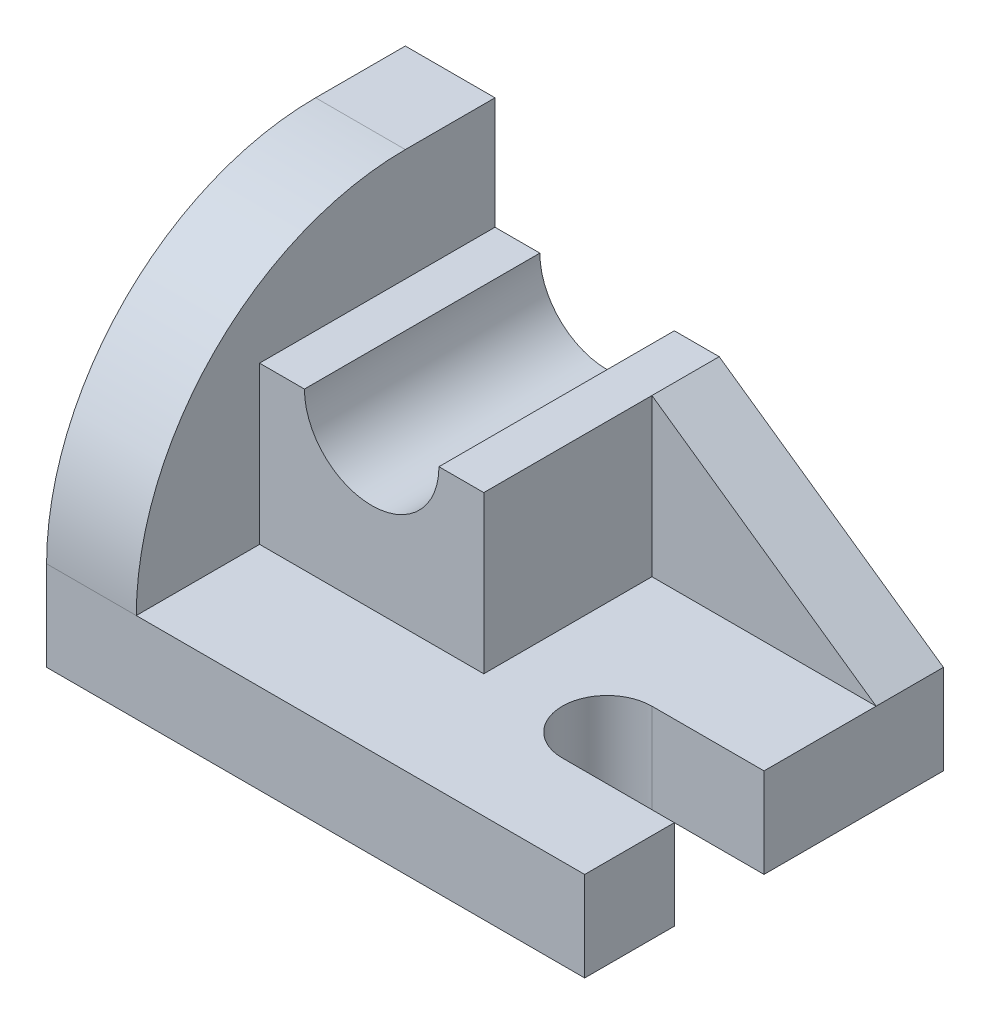
ISO-10303-21;
HEADER;
FILE_DESCRIPTION(('STEP AP214'),'2;1');
FILE_NAME('part.step','',(''),(''),'','','');
FILE_SCHEMA(('AUTOMOTIVE_DESIGN { 1 0 10303 214 1 1 1 1 }'));
ENDSEC;
DATA;
#1=APPLICATION_CONTEXT('core data for automotive mechanical design processes');
#2=APPLICATION_PROTOCOL_DEFINITION('international standard','automotive_design',2000,#1);
#3=PRODUCT_CONTEXT('',#1,'mechanical');
#4=PRODUCT('Part','Part','',(#3));
#5=PRODUCT_RELATED_PRODUCT_CATEGORY('part','',(#4));
#6=PRODUCT_DEFINITION_FORMATION('','',#4);
#7=PRODUCT_DEFINITION_CONTEXT('part definition',#1,'design');
#8=PRODUCT_DEFINITION('design','',#6,#7);
#9=PRODUCT_DEFINITION_SHAPE('','',#8);
#10=(LENGTH_UNIT() NAMED_UNIT(*) SI_UNIT(.MILLI.,.METRE.));
#11=(NAMED_UNIT(*) PLANE_ANGLE_UNIT() SI_UNIT($,.RADIAN.));
#12=(NAMED_UNIT(*) SI_UNIT($,.STERADIAN.) SOLID_ANGLE_UNIT());
#13=UNCERTAINTY_MEASURE_WITH_UNIT(LENGTH_MEASURE(1.E-05),#10,'distance_accuracy_value','');
#14=(GEOMETRIC_REPRESENTATION_CONTEXT(3) GLOBAL_UNCERTAINTY_ASSIGNED_CONTEXT((#13)) GLOBAL_UNIT_ASSIGNED_CONTEXT((#10,
#11,#12)) REPRESENTATION_CONTEXT('',''));
#15=CARTESIAN_POINT('',(0.,0.,0.));
#16=DIRECTION('',(0.,0.,1.));
#17=DIRECTION('',(1.,0.,0.));
#18=AXIS2_PLACEMENT_3D('',#15,#16,#17);
#19=CARTESIAN_POINT('',(0.,44.,0.));
#20=DIRECTION('',(0.,1.,0.));
#21=DIRECTION('',(0.,0.,1.));
#22=AXIS2_PLACEMENT_3D('',#19,#20,#21);
#23=PLANE('',#22);
#24=DIRECTION('',(0.,0.,1.));
#25=VECTOR('',#24,1.);
#26=CARTESIAN_POINT('',(24.,44.,-64.001));
#27=LINE('',#26,#25);
#28=CARTESIAN_POINT('',(24.,44.,-22.));
#29=VERTEX_POINT('',#28);
#30=CARTESIAN_POINT('',(24.,44.,-64.));
#31=VERTEX_POINT('',#30);
#32=EDGE_CURVE('E373',#29,#31,#27,.F.);
#33=ORIENTED_EDGE('',*,*,#32,.T.);
#34=DIRECTION('',(-1.,0.,0.));
#35=VECTOR('',#34,1.);
#36=CARTESIAN_POINT('',(16.,44.,-64.));
#37=LINE('',#36,#35);
#38=CARTESIAN_POINT('',(16.,44.,-64.));
#39=VERTEX_POINT('',#38);
#40=EDGE_CURVE('E69',#31,#39,#37,.T.);
#41=ORIENTED_EDGE('',*,*,#40,.T.);
#42=DIRECTION('',(0.,0.,1.));
#43=VECTOR('',#42,1.);
#44=CARTESIAN_POINT('',(16.,44.,-64.));
#45=LINE('',#44,#43);
#46=CARTESIAN_POINT('',(16.,44.,-22.));
#47=VERTEX_POINT('',#46);
#48=EDGE_CURVE('E219',#39,#47,#45,.T.);
#49=ORIENTED_EDGE('',*,*,#48,.T.);
#50=DIRECTION('',(1.,0.,0.));
#51=VECTOR('',#50,1.);
#52=CARTESIAN_POINT('',(16.,44.,-22.));
#53=LINE('',#52,#51);
#54=EDGE_CURVE('E201',#47,#29,#53,.T.);
#55=ORIENTED_EDGE('',*,*,#54,.T.);
#56=EDGE_LOOP('',(#33,#41,#49,#55));
#57=FACE_BOUND('',#56,.T.);
#58=ADVANCED_FACE('F45',(#57),#23,.T.);
#59=CARTESIAN_POINT('',(0.,16.,0.));
#60=DIRECTION('',(0.,-1.,0.));
#61=DIRECTION('',(0.,0.,-1.));
#62=AXIS2_PLACEMENT_3D('',#59,#60,#61);
#63=PLANE('',#62);
#64=DIRECTION('',(0.,0.,-1.));
#65=VECTOR('',#64,1.);
#66=CARTESIAN_POINT('',(96.,16.,0.));
#67=LINE('',#66,#65);
#68=CARTESIAN_POINT('',(96.,16.,-32.));
#69=VERTEX_POINT('',#68);
#70=CARTESIAN_POINT('',(96.,16.,-52.));
#71=VERTEX_POINT('',#70);
#72=EDGE_CURVE('E297',#69,#71,#67,.T.);
#73=ORIENTED_EDGE('',*,*,#72,.T.);
#74=DIRECTION('',(-1.,0.,0.));
#75=VECTOR('',#74,1.);
#76=CARTESIAN_POINT('',(56.,16.,-52.));
#77=LINE('',#76,#75);
#78=CARTESIAN_POINT('',(56.,16.,-52.));
#79=VERTEX_POINT('',#78);
#80=EDGE_CURVE('E176',#71,#79,#77,.T.);
#81=ORIENTED_EDGE('',*,*,#80,.T.);
#82=DIRECTION('',(0.,0.,-1.));
#83=VECTOR('',#82,1.);
#84=CARTESIAN_POINT('',(56.,16.,-64.));
#85=LINE('',#84,#83);
#86=CARTESIAN_POINT('',(56.,16.,-22.));
#87=VERTEX_POINT('',#86);
#88=EDGE_CURVE('E193',#87,#79,#85,.T.);
#89=ORIENTED_EDGE('',*,*,#88,.F.);
#90=DIRECTION('',(1.,0.,0.));
#91=VECTOR('',#90,1.);
#92=CARTESIAN_POINT('',(16.,16.,-22.));
#93=LINE('',#92,#91);
#94=CARTESIAN_POINT('',(16.,16.,-22.));
#95=VERTEX_POINT('',#94);
#96=EDGE_CURVE('E213',#95,#87,#93,.T.);
#97=ORIENTED_EDGE('',*,*,#96,.F.);
#98=DIRECTION('',(0.,0.,-1.));
#99=VECTOR('',#98,1.);
#100=CARTESIAN_POINT('',(16.,16.,0.));
#101=LINE('',#100,#99);
#102=CARTESIAN_POINT('',(16.,16.,0.));
#103=VERTEX_POINT('',#102);
#104=EDGE_CURVE('E250',#103,#95,#101,.T.);
#105=ORIENTED_EDGE('',*,*,#104,.F.);
#106=DIRECTION('',(1.,0.,0.));
#107=VECTOR('',#106,1.);
#108=CARTESIAN_POINT('',(0.,16.,0.));
#109=LINE('',#108,#107);
#110=CARTESIAN_POINT('',(96.,16.,0.));
#111=VERTEX_POINT('',#110);
#112=EDGE_CURVE('E298',#103,#111,#109,.T.);
#113=ORIENTED_EDGE('',*,*,#112,.T.);
#114=CARTESIAN_POINT('',(96.,16.,-16.));
#115=VERTEX_POINT('',#114);
#116=EDGE_CURVE('E299',#111,#115,#67,.T.);
#117=ORIENTED_EDGE('',*,*,#116,.T.);
#118=DIRECTION('',(1.,0.,0.));
#119=VECTOR('',#118,1.);
#120=CARTESIAN_POINT('',(96.,16.,-16.));
#121=LINE('',#120,#119);
#122=CARTESIAN_POINT('',(76.,16.,-16.));
#123=VERTEX_POINT('',#122);
#124=EDGE_CURVE('E262',#123,#115,#121,.T.);
#125=ORIENTED_EDGE('',*,*,#124,.F.);
#126=CARTESIAN_POINT('',(76.,16.,-24.));
#127=DIRECTION('',(0.,1.,0.));
#128=DIRECTION('',(0.,0.,1.));
#129=AXIS2_PLACEMENT_3D('',#126,#127,#128);
#130=CIRCLE('',#129,8.);
#131=CARTESIAN_POINT('',(76.,16.,-32.));
#132=VERTEX_POINT('',#131);
#133=EDGE_CURVE('E274',#132,#123,#130,.T.);
#134=ORIENTED_EDGE('',*,*,#133,.F.);
#135=DIRECTION('',(-1.,0.,0.));
#136=VECTOR('',#135,1.);
#137=CARTESIAN_POINT('',(96.,16.,-32.));
#138=LINE('',#137,#136);
#139=EDGE_CURVE('E256',#69,#132,#138,.T.);
#140=ORIENTED_EDGE('',*,*,#139,.F.);
#141=EDGE_LOOP('',(#73,#81,#89,#97,#105,#113,#117,#125,#134,#140));
#142=FACE_BOUND('',#141,.T.);
#143=ADVANCED_FACE('F342',(#142),#63,.F.);
#144=CARTESIAN_POINT('',(16.,16.,-48.));
#145=DIRECTION('',(-1.,0.,0.));
#146=DIRECTION('',(0.,0.,1.));
#147=AXIS2_PLACEMENT_3D('',#144,#145,#146);
#148=PLANE('',#147);
#149=DIRECTION('',(0.,-1.,0.));
#150=VECTOR('',#149,1.);
#151=CARTESIAN_POINT('',(16.,44.,-22.));
#152=LINE('',#151,#150);
#153=EDGE_CURVE('E222',#47,#95,#152,.T.);
#154=ORIENTED_EDGE('',*,*,#153,.F.);
#155=ORIENTED_EDGE('',*,*,#48,.F.);
#156=DIRECTION('',(0.,-1.,0.));
#157=VECTOR('',#156,1.);
#158=CARTESIAN_POINT('',(16.,0.,-64.));
#159=LINE('',#158,#157);
#160=CARTESIAN_POINT('',(16.,64.,-64.));
#161=VERTEX_POINT('',#160);
#162=EDGE_CURVE('E226',#161,#39,#159,.T.);
#163=ORIENTED_EDGE('',*,*,#162,.F.);
#164=DIRECTION('',(0.,0.,-1.));
#165=VECTOR('',#164,1.);
#166=CARTESIAN_POINT('',(16.,64.,-64.));
#167=LINE('',#166,#165);
#168=CARTESIAN_POINT('',(16.,64.,-48.0000000000003));
#169=VERTEX_POINT('',#168);
#170=EDGE_CURVE('E235',#169,#161,#167,.T.);
#171=ORIENTED_EDGE('',*,*,#170,.F.);
#172=CARTESIAN_POINT('',(16.,16.,-48.));
#173=DIRECTION('',(-1.,0.,0.));
#174=DIRECTION('',(0.,0.,1.));
#175=AXIS2_PLACEMENT_3D('',#172,#173,#174);
#176=CIRCLE('',#175,48.);
#177=EDGE_CURVE('E230',#103,#169,#176,.T.);
#178=ORIENTED_EDGE('',*,*,#177,.F.);
#179=ORIENTED_EDGE('',*,*,#104,.T.);
#180=EDGE_LOOP('',(#154,#155,#163,#171,#178,#179));
#181=FACE_BOUND('',#180,.T.);
#182=ADVANCED_FACE('F367',(#181),#148,.F.);
#183=CARTESIAN_POINT('',(96.,16.,0.));
#184=DIRECTION('',(-1.,0.,0.));
#185=DIRECTION('',(0.,0.,1.));
#186=AXIS2_PLACEMENT_3D('',#183,#184,#185);
#187=PLANE('',#186);
#188=DIRECTION('',(0.,0.,-1.));
#189=VECTOR('',#188,1.);
#190=CARTESIAN_POINT('',(96.,0.,0.));
#191=LINE('',#190,#189);
#192=CARTESIAN_POINT('',(96.,0.,0.));
#193=VERTEX_POINT('',#192);
#194=CARTESIAN_POINT('',(96.,0.,-16.));
#195=VERTEX_POINT('',#194);
#196=EDGE_CURVE('E311',#193,#195,#191,.T.);
#197=ORIENTED_EDGE('',*,*,#196,.T.);
#198=DIRECTION('',(0.,1.,0.));
#199=VECTOR('',#198,1.);
#200=CARTESIAN_POINT('',(96.,0.,-16.));
#201=LINE('',#200,#199);
#202=EDGE_CURVE('E280',#195,#115,#201,.T.);
#203=ORIENTED_EDGE('',*,*,#202,.T.);
#204=ORIENTED_EDGE('',*,*,#116,.F.);
#205=DIRECTION('',(0.,-1.,0.));
#206=VECTOR('',#205,1.);
#207=CARTESIAN_POINT('',(96.,16.,0.));
#208=LINE('',#207,#206);
#209=EDGE_CURVE('E54',#111,#193,#208,.T.);
#210=ORIENTED_EDGE('',*,*,#209,.T.);
#211=EDGE_LOOP('',(#197,#203,#204,#210));
#212=FACE_BOUND('',#211,.T.);
#213=ADVANCED_FACE('F330',(#212),#187,.F.);
#214=CARTESIAN_POINT('',(0.,16.,0.));
#215=DIRECTION('',(1.,0.,0.));
#216=DIRECTION('',(0.,0.,-1.));
#217=AXIS2_PLACEMENT_3D('',#214,#215,#216);
#218=PLANE('',#217);
#219=DIRECTION('',(0.,0.,1.));
#220=VECTOR('',#219,1.);
#221=CARTESIAN_POINT('',(0.,0.,0.));
#222=LINE('',#221,#220);
#223=CARTESIAN_POINT('',(0.,0.,-64.));
#224=VERTEX_POINT('',#223);
#225=CARTESIAN_POINT('',(0.,0.,0.));
#226=VERTEX_POINT('',#225);
#227=EDGE_CURVE('E284',#224,#226,#222,.T.);
#228=ORIENTED_EDGE('',*,*,#227,.T.);
#229=DIRECTION('',(0.,-1.,0.));
#230=VECTOR('',#229,1.);
#231=CARTESIAN_POINT('',(0.,16.,0.));
#232=LINE('',#231,#230);
#233=CARTESIAN_POINT('',(0.,15.9999999999997,0.));
#234=VERTEX_POINT('',#233);
#235=EDGE_CURVE('E11',#234,#226,#232,.T.);
#236=ORIENTED_EDGE('',*,*,#235,.F.);
#237=CARTESIAN_POINT('',(0.,16.,-48.));
#238=DIRECTION('',(-1.,0.,0.));
#239=DIRECTION('',(0.,0.,1.));
#240=AXIS2_PLACEMENT_3D('',#237,#238,#239);
#241=CIRCLE('',#240,48.);
#242=CARTESIAN_POINT('',(0.,64.,-48.0000000000003));
#243=VERTEX_POINT('',#242);
#244=EDGE_CURVE('E225',#234,#243,#241,.T.);
#245=ORIENTED_EDGE('',*,*,#244,.T.);
#246=DIRECTION('',(0.,0.,-1.));
#247=VECTOR('',#246,1.);
#248=CARTESIAN_POINT('',(0.,64.,-64.));
#249=LINE('',#248,#247);
#250=CARTESIAN_POINT('',(0.,64.,-64.));
#251=VERTEX_POINT('',#250);
#252=EDGE_CURVE('E231',#243,#251,#249,.T.);
#253=ORIENTED_EDGE('',*,*,#252,.T.);
#254=DIRECTION('',(0.,-1.,0.));
#255=VECTOR('',#254,1.);
#256=CARTESIAN_POINT('',(0.,16.,-64.));
#257=LINE('',#256,#255);
#258=EDGE_CURVE('E303',#251,#224,#257,.T.);
#259=ORIENTED_EDGE('',*,*,#258,.T.);
#260=EDGE_LOOP('',(#228,#236,#245,#253,#259));
#261=FACE_BOUND('',#260,.T.);
#262=ADVANCED_FACE('F47',(#261),#218,.F.);
#263=CARTESIAN_POINT('',(0.,16.,0.));
#264=DIRECTION('',(0.,0.,-1.));
#265=DIRECTION('',(-1.,0.,0.));
#266=AXIS2_PLACEMENT_3D('',#263,#264,#265);
#267=PLANE('',#266);
#268=DIRECTION('',(1.,0.,0.));
#269=VECTOR('',#268,1.);
#270=CARTESIAN_POINT('',(0.,0.,0.));
#271=LINE('',#270,#269);
#272=EDGE_CURVE('E307',#226,#193,#271,.T.);
#273=ORIENTED_EDGE('',*,*,#272,.T.);
#274=ORIENTED_EDGE('',*,*,#209,.F.);
#275=ORIENTED_EDGE('',*,*,#112,.F.);
#276=EDGE_CURVE('E293',#234,#103,#109,.T.);
#277=ORIENTED_EDGE('',*,*,#276,.F.);
#278=ORIENTED_EDGE('',*,*,#235,.T.);
#279=EDGE_LOOP('',(#273,#274,#275,#277,#278));
#280=FACE_BOUND('',#279,.T.);
#281=ADVANCED_FACE('F434',(#280),#267,.F.);
#282=ORIENTED_EDGE('',*,*,#72,.F.);
#283=DIRECTION('',(0.,1.,0.));
#284=VECTOR('',#283,1.);
#285=CARTESIAN_POINT('',(96.,0.,-32.));
#286=LINE('',#285,#284);
#287=CARTESIAN_POINT('',(96.,0.,-32.));
#288=VERTEX_POINT('',#287);
#289=EDGE_CURVE('E270',#288,#69,#286,.T.);
#290=ORIENTED_EDGE('',*,*,#289,.F.);
#291=CARTESIAN_POINT('',(96.,0.,-64.));
#292=VERTEX_POINT('',#291);
#293=EDGE_CURVE('E310',#288,#292,#191,.T.);
#294=ORIENTED_EDGE('',*,*,#293,.T.);
#295=DIRECTION('',(0.,-1.,0.));
#296=VECTOR('',#295,1.);
#297=CARTESIAN_POINT('',(96.,16.,-64.));
#298=LINE('',#297,#296);
#299=CARTESIAN_POINT('',(96.,16.,-64.));
#300=VERTEX_POINT('',#299);
#301=EDGE_CURVE('E321',#300,#292,#298,.T.);
#302=ORIENTED_EDGE('',*,*,#301,.F.);
#303=DIRECTION('',(0.,0.,-1.));
#304=VECTOR('',#303,1.);
#305=CARTESIAN_POINT('',(96.,16.,-52.));
#306=LINE('',#305,#304);
#307=EDGE_CURVE('E175',#71,#300,#306,.T.);
#308=ORIENTED_EDGE('',*,*,#307,.F.);
#309=EDGE_LOOP('',(#282,#290,#294,#302,#308));
#310=FACE_BOUND('',#309,.T.);
#311=ADVANCED_FACE('F354',(#310),#187,.F.);
#312=CARTESIAN_POINT('',(0.,16.,-64.));
#313=DIRECTION('',(0.,0.,1.));
#314=DIRECTION('',(1.,0.,0.));
#315=AXIS2_PLACEMENT_3D('',#312,#313,#314);
#316=PLANE('',#315);
#317=ORIENTED_EDGE('',*,*,#40,.F.);
#318=CARTESIAN_POINT('',(36.,44.,-64.));
#319=DIRECTION('',(0.,0.,1.));
#320=DIRECTION('',(1.,0.,0.));
#321=AXIS2_PLACEMENT_3D('',#318,#319,#320);
#322=CIRCLE('',#321,12.);
#323=CARTESIAN_POINT('',(48.,44.,-64.));
#324=VERTEX_POINT('',#323);
#325=EDGE_CURVE('E216',#324,#31,#322,.F.);
#326=ORIENTED_EDGE('',*,*,#325,.F.);
#327=CARTESIAN_POINT('',(56.,44.,-64.));
#328=VERTEX_POINT('',#327);
#329=EDGE_CURVE('E205',#328,#324,#37,.T.);
#330=ORIENTED_EDGE('',*,*,#329,.F.);
#331=DIRECTION('',(0.81923192051904,-0.573462344363329,0.));
#332=VECTOR('',#331,1.);
#333=CARTESIAN_POINT('',(56.,44.,-64.));
#334=LINE('',#333,#332);
#335=EDGE_CURVE('E169',#328,#300,#334,.T.);
#336=ORIENTED_EDGE('',*,*,#335,.T.);
#337=ORIENTED_EDGE('',*,*,#301,.T.);
#338=DIRECTION('',(-1.,0.,0.));
#339=VECTOR('',#338,1.);
#340=CARTESIAN_POINT('',(0.,0.,-64.));
#341=LINE('',#340,#339);
#342=EDGE_CURVE('E315',#292,#224,#341,.T.);
#343=ORIENTED_EDGE('',*,*,#342,.T.);
#344=ORIENTED_EDGE('',*,*,#258,.F.);
#345=DIRECTION('',(-1.,0.,0.));
#346=VECTOR('',#345,1.);
#347=CARTESIAN_POINT('',(16.,64.,-64.));
#348=LINE('',#347,#346);
#349=EDGE_CURVE('E246',#161,#251,#348,.T.);
#350=ORIENTED_EDGE('',*,*,#349,.F.);
#351=ORIENTED_EDGE('',*,*,#162,.T.);
#352=EDGE_LOOP('',(#317,#326,#330,#336,#337,#343,#344,#350,#351));
#353=FACE_BOUND('',#352,.T.);
#354=ADVANCED_FACE('F357',(#353),#316,.F.);
#355=CARTESIAN_POINT('',(0.,0.,0.));
#356=DIRECTION('',(0.,-1.,0.));
#357=DIRECTION('',(0.,0.,-1.));
#358=AXIS2_PLACEMENT_3D('',#355,#356,#357);
#359=PLANE('',#358);
#360=ORIENTED_EDGE('',*,*,#227,.F.);
#361=ORIENTED_EDGE('',*,*,#342,.F.);
#362=ORIENTED_EDGE('',*,*,#293,.F.);
#363=DIRECTION('',(-1.,0.,0.));
#364=VECTOR('',#363,1.);
#365=CARTESIAN_POINT('',(96.,0.,-32.));
#366=LINE('',#365,#364);
#367=CARTESIAN_POINT('',(76.,0.,-32.));
#368=VERTEX_POINT('',#367);
#369=EDGE_CURVE('E257',#288,#368,#366,.T.);
#370=ORIENTED_EDGE('',*,*,#369,.T.);
#371=CARTESIAN_POINT('',(76.,0.,-24.));
#372=DIRECTION('',(0.,1.,0.));
#373=DIRECTION('',(0.,0.,1.));
#374=AXIS2_PLACEMENT_3D('',#371,#372,#373);
#375=CIRCLE('',#374,8.);
#376=CARTESIAN_POINT('',(76.,0.,-16.));
#377=VERTEX_POINT('',#376);
#378=EDGE_CURVE('E261',#368,#377,#375,.T.);
#379=ORIENTED_EDGE('',*,*,#378,.T.);
#380=DIRECTION('',(1.,0.,0.));
#381=VECTOR('',#380,1.);
#382=CARTESIAN_POINT('',(96.,0.,-16.));
#383=LINE('',#382,#381);
#384=EDGE_CURVE('E266',#377,#195,#383,.T.);
#385=ORIENTED_EDGE('',*,*,#384,.T.);
#386=ORIENTED_EDGE('',*,*,#196,.F.);
#387=ORIENTED_EDGE('',*,*,#272,.F.);
#388=EDGE_LOOP('',(#360,#361,#362,#370,#379,#385,#386,#387));
#389=FACE_BOUND('',#388,.T.);
#390=ADVANCED_FACE('F335',(#389),#359,.T.);
#391=CARTESIAN_POINT('',(96.,0.,-16.));
#392=DIRECTION('',(0.,0.,1.));
#393=DIRECTION('',(1.,0.,0.));
#394=AXIS2_PLACEMENT_3D('',#391,#392,#393);
#395=PLANE('',#394);
#396=ORIENTED_EDGE('',*,*,#124,.T.);
#397=ORIENTED_EDGE('',*,*,#202,.F.);
#398=ORIENTED_EDGE('',*,*,#384,.F.);
#399=DIRECTION('',(0.,1.,0.));
#400=VECTOR('',#399,1.);
#401=CARTESIAN_POINT('',(76.,0.,-16.));
#402=LINE('',#401,#400);
#403=EDGE_CURVE('E285',#377,#123,#402,.T.);
#404=ORIENTED_EDGE('',*,*,#403,.T.);
#405=EDGE_LOOP('',(#396,#397,#398,#404));
#406=FACE_BOUND('',#405,.T.);
#407=ADVANCED_FACE('F338',(#406),#395,.F.);
#408=CARTESIAN_POINT('',(76.,0.,-24.));
#409=DIRECTION('',(0.,1.,0.));
#410=DIRECTION('',(0.,0.,1.));
#411=AXIS2_PLACEMENT_3D('',#408,#409,#410);
#412=CYLINDRICAL_SURFACE('',#411,8.);
#413=ORIENTED_EDGE('',*,*,#133,.T.);
#414=ORIENTED_EDGE('',*,*,#403,.F.);
#415=ORIENTED_EDGE('',*,*,#378,.F.);
#416=DIRECTION('',(0.,1.,0.));
#417=VECTOR('',#416,1.);
#418=CARTESIAN_POINT('',(76.,0.,-32.));
#419=LINE('',#418,#417);
#420=EDGE_CURVE('E288',#368,#132,#419,.T.);
#421=ORIENTED_EDGE('',*,*,#420,.T.);
#422=EDGE_LOOP('',(#413,#414,#415,#421));
#423=FACE_BOUND('',#422,.T.);
#424=ADVANCED_FACE('F394',(#423),#412,.F.);
#425=CARTESIAN_POINT('',(96.,0.,-32.));
#426=DIRECTION('',(0.,0.,-1.));
#427=DIRECTION('',(-1.,0.,0.));
#428=AXIS2_PLACEMENT_3D('',#425,#426,#427);
#429=PLANE('',#428);
#430=ORIENTED_EDGE('',*,*,#139,.T.);
#431=ORIENTED_EDGE('',*,*,#420,.F.);
#432=ORIENTED_EDGE('',*,*,#369,.F.);
#433=ORIENTED_EDGE('',*,*,#289,.T.);
#434=EDGE_LOOP('',(#430,#431,#432,#433));
#435=FACE_BOUND('',#434,.T.);
#436=ADVANCED_FACE('F392',(#435),#429,.F.);
#437=CARTESIAN_POINT('',(16.,64.,-64.));
#438=DIRECTION('',(0.,1.,0.));
#439=DIRECTION('',(0.,0.,1.));
#440=AXIS2_PLACEMENT_3D('',#437,#438,#439);
#441=PLANE('',#440);
#442=ORIENTED_EDGE('',*,*,#252,.F.);
#443=DIRECTION('',(-1.,0.,0.));
#444=VECTOR('',#443,1.);
#445=CARTESIAN_POINT('',(16.,64.,-48.0000000000003));
#446=LINE('',#445,#444);
#447=EDGE_CURVE('E239',#169,#243,#446,.T.);
#448=ORIENTED_EDGE('',*,*,#447,.F.);
#449=ORIENTED_EDGE('',*,*,#170,.T.);
#450=ORIENTED_EDGE('',*,*,#349,.T.);
#451=EDGE_LOOP('',(#442,#448,#449,#450));
#452=FACE_BOUND('',#451,.T.);
#453=ADVANCED_FACE('F362',(#452),#441,.T.);
#454=CARTESIAN_POINT('',(16.,16.,-48.));
#455=DIRECTION('',(-1.,0.,0.));
#456=DIRECTION('',(0.,0.,1.));
#457=AXIS2_PLACEMENT_3D('',#454,#455,#456);
#458=CYLINDRICAL_SURFACE('',#457,48.);
#459=ORIENTED_EDGE('',*,*,#244,.F.);
#460=ORIENTED_EDGE('',*,*,#276,.T.);
#461=ORIENTED_EDGE('',*,*,#177,.T.);
#462=ORIENTED_EDGE('',*,*,#447,.T.);
#463=EDGE_LOOP('',(#459,#460,#461,#462));
#464=FACE_BOUND('',#463,.T.);
#465=ADVANCED_FACE('F423',(#464),#458,.T.);
#466=CARTESIAN_POINT('',(16.,44.,-22.));
#467=DIRECTION('',(0.,0.,-1.));
#468=DIRECTION('',(-1.,0.,0.));
#469=AXIS2_PLACEMENT_3D('',#466,#467,#468);
#470=PLANE('',#469);
#471=CARTESIAN_POINT('',(48.,44.,-22.));
#472=VERTEX_POINT('',#471);
#473=CARTESIAN_POINT('',(56.,44.,-22.));
#474=VERTEX_POINT('',#473);
#475=EDGE_CURVE('E198',#472,#474,#53,.T.);
#476=ORIENTED_EDGE('',*,*,#475,.F.);
#477=CARTESIAN_POINT('',(36.,44.,-22.));
#478=DIRECTION('',(0.,0.,1.));
#479=DIRECTION('',(1.,0.,0.));
#480=AXIS2_PLACEMENT_3D('',#477,#478,#479);
#481=CIRCLE('',#480,12.);
#482=EDGE_CURVE('E61',#29,#472,#481,.T.);
#483=ORIENTED_EDGE('',*,*,#482,.F.);
#484=ORIENTED_EDGE('',*,*,#54,.F.);
#485=ORIENTED_EDGE('',*,*,#153,.T.);
#486=ORIENTED_EDGE('',*,*,#96,.T.);
#487=DIRECTION('',(0.,-1.,0.));
#488=VECTOR('',#487,1.);
#489=CARTESIAN_POINT('',(56.,44.,-22.));
#490=LINE('',#489,#488);
#491=EDGE_CURVE('E212',#474,#87,#490,.T.);
#492=ORIENTED_EDGE('',*,*,#491,.F.);
#493=EDGE_LOOP('',(#476,#483,#484,#485,#486,#492));
#494=FACE_BOUND('',#493,.T.);
#495=ADVANCED_FACE('F376',(#494),#470,.F.);
#496=CARTESIAN_POINT('',(56.,44.,-64.));
#497=DIRECTION('',(-1.,0.,0.));
#498=DIRECTION('',(0.,0.,1.));
#499=AXIS2_PLACEMENT_3D('',#496,#497,#498);
#500=PLANE('',#499);
#501=ORIENTED_EDGE('',*,*,#88,.T.);
#502=DIRECTION('',(0.,1.,0.));
#503=VECTOR('',#502,1.);
#504=CARTESIAN_POINT('',(56.,44.,-52.));
#505=LINE('',#504,#503);
#506=CARTESIAN_POINT('',(56.,44.,-52.));
#507=VERTEX_POINT('',#506);
#508=EDGE_CURVE('E181',#79,#507,#505,.T.);
#509=ORIENTED_EDGE('',*,*,#508,.T.);
#510=DIRECTION('',(0.,0.,-1.));
#511=VECTOR('',#510,1.);
#512=CARTESIAN_POINT('',(56.,44.,-64.));
#513=LINE('',#512,#511);
#514=EDGE_CURVE('E191',#474,#507,#513,.T.);
#515=ORIENTED_EDGE('',*,*,#514,.F.);
#516=ORIENTED_EDGE('',*,*,#491,.T.);
#517=EDGE_LOOP('',(#501,#509,#515,#516));
#518=FACE_BOUND('',#517,.T.);
#519=ADVANCED_FACE('F189',(#518),#500,.F.);
#520=DIRECTION('',(0.,0.,1.));
#521=VECTOR('',#520,1.);
#522=CARTESIAN_POINT('',(48.,44.,-64.001));
#523=LINE('',#522,#521);
#524=EDGE_CURVE('E371',#324,#472,#523,.T.);
#525=ORIENTED_EDGE('',*,*,#524,.T.);
#526=ORIENTED_EDGE('',*,*,#475,.T.);
#527=ORIENTED_EDGE('',*,*,#514,.T.);
#528=DIRECTION('',(0.,0.,-1.));
#529=VECTOR('',#528,1.);
#530=CARTESIAN_POINT('',(56.,44.,-52.));
#531=LINE('',#530,#529);
#532=EDGE_CURVE('E163',#507,#328,#531,.T.);
#533=ORIENTED_EDGE('',*,*,#532,.T.);
#534=ORIENTED_EDGE('',*,*,#329,.T.);
#535=EDGE_LOOP('',(#525,#526,#527,#533,#534));
#536=FACE_BOUND('',#535,.T.);
#537=ADVANCED_FACE('F196',(#536),#23,.T.);
#538=CARTESIAN_POINT('',(36.,44.,-64.001));
#539=DIRECTION('',(0.,0.,1.));
#540=DIRECTION('',(1.,0.,0.));
#541=AXIS2_PLACEMENT_3D('',#538,#539,#540);
#542=CYLINDRICAL_SURFACE('',#541,12.);
#543=ORIENTED_EDGE('',*,*,#482,.T.);
#544=ORIENTED_EDGE('',*,*,#524,.F.);
#545=ORIENTED_EDGE('',*,*,#325,.T.);
#546=ORIENTED_EDGE('',*,*,#32,.F.);
#547=EDGE_LOOP('',(#543,#544,#545,#546));
#548=FACE_BOUND('',#547,.T.);
#549=ADVANCED_FACE('F414',(#548),#542,.F.);
#550=CARTESIAN_POINT('',(56.,44.,-52.));
#551=DIRECTION('',(0.573462344363329,0.81923192051904,0.));
#552=DIRECTION('',(-0.81923192051904,0.573462344363329,0.));
#553=AXIS2_PLACEMENT_3D('',#550,#551,#552);
#554=PLANE('',#553);
#555=ORIENTED_EDGE('',*,*,#335,.F.);
#556=ORIENTED_EDGE('',*,*,#532,.F.);
#557=DIRECTION('',(0.81923192051904,-0.573462344363329,0.));
#558=VECTOR('',#557,1.);
#559=CARTESIAN_POINT('',(56.,44.,-52.));
#560=LINE('',#559,#558);
#561=EDGE_CURVE('E166',#507,#71,#560,.T.);
#562=ORIENTED_EDGE('',*,*,#561,.T.);
#563=ORIENTED_EDGE('',*,*,#307,.T.);
#564=EDGE_LOOP('',(#555,#556,#562,#563));
#565=FACE_BOUND('',#564,.T.);
#566=ADVANCED_FACE('F165',(#565),#554,.T.);
#567=CARTESIAN_POINT('',(0.,0.,-52.));
#568=DIRECTION('',(0.,0.,1.));
#569=DIRECTION('',(1.,0.,0.));
#570=AXIS2_PLACEMENT_3D('',#567,#568,#569);
#571=PLANE('',#570);
#572=ORIENTED_EDGE('',*,*,#508,.F.);
#573=ORIENTED_EDGE('',*,*,#80,.F.);
#574=ORIENTED_EDGE('',*,*,#561,.F.);
#575=EDGE_LOOP('',(#572,#573,#574));
#576=FACE_BOUND('',#575,.T.);
#577=ADVANCED_FACE('F180',(#576),#571,.T.);
#578=CLOSED_SHELL('',(#58,#143,#182,#213,#262,#281,#311,#354,#390,#407,#424,#436,#453,#465,#495,
#519,#537,#549,#566,#577));
#579=MANIFOLD_SOLID_BREP('B2',#578);
#580=ADVANCED_BREP_SHAPE_REPRESENTATION('',(#18,#579),#14);
#581=SHAPE_DEFINITION_REPRESENTATION(#9,#580);
ENDSEC;
END-ISO-10303-21;
